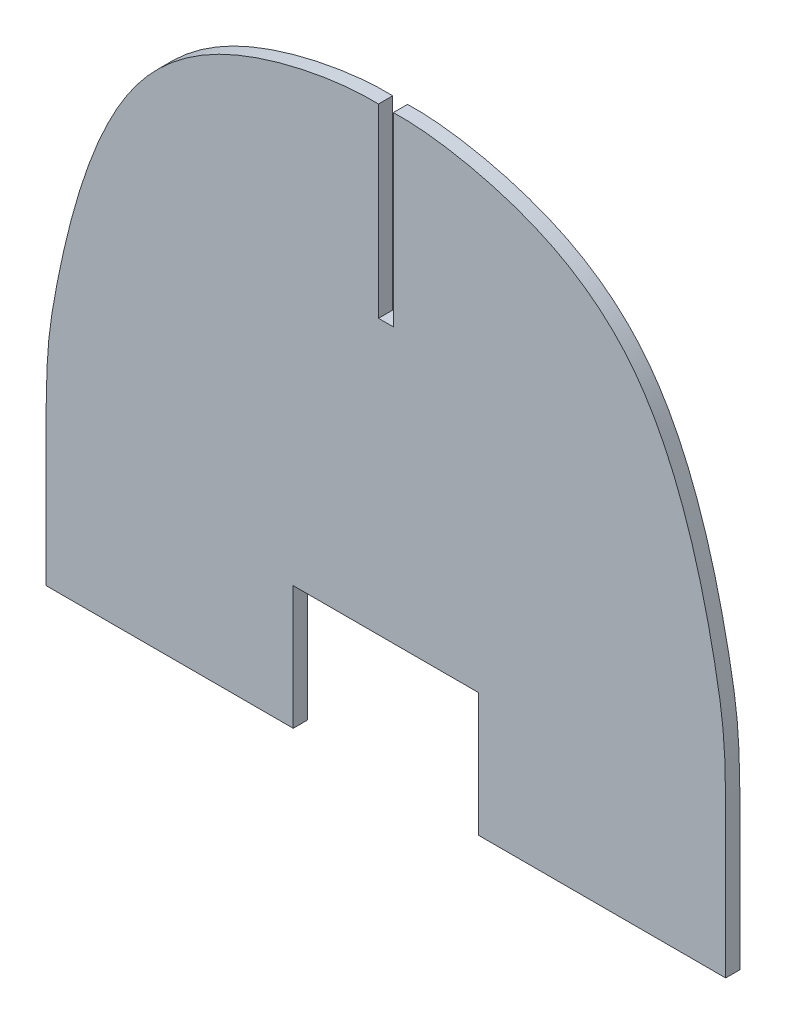
ISO-10303-21;
HEADER;
FILE_DESCRIPTION(('STEP AP214'),'2;1');
FILE_NAME('part.step','',(''),(''),'','','');
FILE_SCHEMA(('AUTOMOTIVE_DESIGN { 1 0 10303 214 1 1 1 1 }'));
ENDSEC;
DATA;
#1=APPLICATION_CONTEXT('core data for automotive mechanical design processes');
#2=APPLICATION_PROTOCOL_DEFINITION('international standard','automotive_design',2000,#1);
#3=PRODUCT_CONTEXT('',#1,'mechanical');
#4=PRODUCT('Part','Part','',(#3));
#5=PRODUCT_RELATED_PRODUCT_CATEGORY('part','',(#4));
#6=PRODUCT_DEFINITION_FORMATION('','',#4);
#7=PRODUCT_DEFINITION_CONTEXT('part definition',#1,'design');
#8=PRODUCT_DEFINITION('design','',#6,#7);
#9=PRODUCT_DEFINITION_SHAPE('','',#8);
#10=(LENGTH_UNIT() NAMED_UNIT(*) SI_UNIT(.MILLI.,.METRE.));
#11=(NAMED_UNIT(*) PLANE_ANGLE_UNIT() SI_UNIT($,.RADIAN.));
#12=(NAMED_UNIT(*) SI_UNIT($,.STERADIAN.) SOLID_ANGLE_UNIT());
#13=UNCERTAINTY_MEASURE_WITH_UNIT(LENGTH_MEASURE(1.E-05),#10,'distance_accuracy_value','');
#14=(GEOMETRIC_REPRESENTATION_CONTEXT(3) GLOBAL_UNCERTAINTY_ASSIGNED_CONTEXT((#13)) GLOBAL_UNIT_ASSIGNED_CONTEXT((#10,
#11,#12)) REPRESENTATION_CONTEXT('',''));
#15=CARTESIAN_POINT('',(0.,0.,0.));
#16=DIRECTION('',(0.,0.,1.));
#17=DIRECTION('',(1.,0.,0.));
#18=AXIS2_PLACEMENT_3D('',#15,#16,#17);
#19=CARTESIAN_POINT('',(139.7,39.6875,5.842));
#20=CARTESIAN_POINT('',(139.7,115.503243220382,5.842));
#21=CARTESIAN_POINT('',(141.431993663014,126.233406498269,5.842));
#22=CARTESIAN_POINT('',(117.029317673098,231.616459974822,5.842));
#23=CARTESIAN_POINT('',(63.3714943176251,272.227754170434,5.842));
#24=CARTESIAN_POINT('',(16.4923819257322,280.353025588496,5.842));
#25=CARTESIAN_POINT('',(0.899505201919916,279.4,5.842));
#26=CARTESIAN_POINT('',(0.,279.4,5.842));
#27=B_SPLINE_CURVE_WITH_KNOTS('',3,(#19,#20,#21,#22,#23,#24,#25,#26),.UNSPECIFIED.,.F.,.F.,(4,1,
1,1,1,4),(0.,0.342953298218703,0.632685127176625,0.805279320711567,0.990263966035578,1.),.UNSPECIFIED.);
#28=DIRECTION('',(0.,0.,-1.));
#29=VECTOR('',#28,1.);
#30=SURFACE_OF_LINEAR_EXTRUSION('',#27,#29);
#31=CARTESIAN_POINT('',(139.7,39.6875,0.));
#32=CARTESIAN_POINT('',(139.7,115.503243220382,0.));
#33=CARTESIAN_POINT('',(141.431993663014,126.233406498269,0.));
#34=CARTESIAN_POINT('',(117.029317673098,231.616459974822,0.));
#35=CARTESIAN_POINT('',(63.3714943176251,272.227754170434,0.));
#36=CARTESIAN_POINT('',(16.4923819257322,280.353025588496,0.));
#37=CARTESIAN_POINT('',(0.899505201919916,279.4,0.));
#38=CARTESIAN_POINT('',(0.,279.4,0.));
#39=B_SPLINE_CURVE_WITH_KNOTS('',3,(#31,#32,#33,#34,#35,#36,#37,#38),.UNSPECIFIED.,.F.,.F.,(4,1,
1,1,1,4),(0.,0.342953298218703,0.632685127176625,0.805279320711567,0.990263966035578,1.),.UNSPECIFIED.);
#40=CARTESIAN_POINT('',(139.7,39.6875,0.));
#41=VERTEX_POINT('',#40);
#42=CARTESIAN_POINT('',(3.048,279.504167611445,0.));
#43=VERTEX_POINT('',#42);
#44=EDGE_CURVE('E210',#41,#43,#39,.T.);
#45=ORIENTED_EDGE('',*,*,#44,.T.);
#46=DIRECTION('',(0.,0.,-1.));
#47=VECTOR('',#46,1.);
#48=CARTESIAN_POINT('',(3.04800000000001,279.504167611483,5.842));
#49=LINE('',#48,#47);
#50=CARTESIAN_POINT('',(3.048,279.504167611445,5.842));
#51=VERTEX_POINT('',#50);
#52=EDGE_CURVE('E223',#43,#51,#49,.F.);
#53=ORIENTED_EDGE('',*,*,#52,.T.);
#54=CARTESIAN_POINT('',(139.7,39.6875,5.842));
#55=VERTEX_POINT('',#54);
#56=EDGE_CURVE('E202',#55,#51,#27,.T.);
#57=ORIENTED_EDGE('',*,*,#56,.F.);
#58=DIRECTION('',(0.,0.,-1.));
#59=VECTOR('',#58,1.);
#60=CARTESIAN_POINT('',(139.7,39.6875,5.842));
#61=LINE('',#60,#59);
#62=EDGE_CURVE('E11',#55,#41,#61,.T.);
#63=ORIENTED_EDGE('',*,*,#62,.T.);
#64=EDGE_LOOP('',(#45,#53,#57,#63));
#65=FACE_BOUND('',#64,.T.);
#66=ADVANCED_FACE('F33',(#65),#30,.F.);
#67=CARTESIAN_POINT('',(139.7,39.6875,5.842));
#68=DIRECTION('',(0.,1.,0.));
#69=DIRECTION('',(-1.,0.,0.));
#70=AXIS2_PLACEMENT_3D('',#67,#68,#69);
#71=PLANE('',#70);
#72=DIRECTION('',(1.,0.,0.));
#73=VECTOR('',#72,1.);
#74=CARTESIAN_POINT('',(139.7,39.6875,5.842));
#75=LINE('',#74,#73);
#76=CARTESIAN_POINT('',(38.1,39.6875,5.842));
#77=VERTEX_POINT('',#76);
#78=EDGE_CURVE('E41',#77,#55,#75,.T.);
#79=ORIENTED_EDGE('',*,*,#78,.F.);
#80=DIRECTION('',(0.,0.,1.));
#81=VECTOR('',#80,1.);
#82=CARTESIAN_POINT('',(38.1,39.6875,0.));
#83=LINE('',#82,#81);
#84=CARTESIAN_POINT('',(38.1,39.6875,0.));
#85=VERTEX_POINT('',#84);
#86=EDGE_CURVE('E198',#85,#77,#83,.T.);
#87=ORIENTED_EDGE('',*,*,#86,.F.);
#88=DIRECTION('',(1.,0.,0.));
#89=VECTOR('',#88,1.);
#90=CARTESIAN_POINT('',(139.7,39.6875,0.));
#91=LINE('',#90,#89);
#92=EDGE_CURVE('E204',#85,#41,#91,.T.);
#93=ORIENTED_EDGE('',*,*,#92,.T.);
#94=ORIENTED_EDGE('',*,*,#62,.F.);
#95=EDGE_LOOP('',(#79,#87,#93,#94));
#96=FACE_BOUND('',#95,.T.);
#97=ADVANCED_FACE('F186',(#96),#71,.F.);
#98=CARTESIAN_POINT('',(123.600312479833,194.335664051359,5.842));
#99=DIRECTION('',(0.,0.,-1.));
#100=DIRECTION('',(-1.,0.,0.));
#101=AXIS2_PLACEMENT_3D('',#98,#99,#100);
#102=PLANE('',#101);
#103=ORIENTED_EDGE('',*,*,#56,.T.);
#104=DIRECTION('',(0.,1.,0.));
#105=VECTOR('',#104,1.);
#106=CARTESIAN_POINT('',(3.048,282.232492089932,5.842));
#107=LINE('',#106,#105);
#108=CARTESIAN_POINT('',(3.04800000000001,203.2,5.842));
#109=VERTEX_POINT('',#108);
#110=EDGE_CURVE('E118',#109,#51,#107,.T.);
#111=ORIENTED_EDGE('',*,*,#110,.F.);
#112=DIRECTION('',(1.,0.,0.));
#113=VECTOR('',#112,1.);
#114=CARTESIAN_POINT('',(0.,203.2,5.842));
#115=LINE('',#114,#113);
#116=CARTESIAN_POINT('',(-3.04800000000001,203.2,5.842));
#117=VERTEX_POINT('',#116);
#118=EDGE_CURVE('E110',#117,#109,#115,.T.);
#119=ORIENTED_EDGE('',*,*,#118,.F.);
#120=DIRECTION('',(0.,1.,0.));
#121=VECTOR('',#120,1.);
#122=CARTESIAN_POINT('',(-3.048,282.232492089932,5.842));
#123=LINE('',#122,#121);
#124=CARTESIAN_POINT('',(-3.048,279.504167611445,5.842));
#125=VERTEX_POINT('',#124);
#126=EDGE_CURVE('E116',#117,#125,#123,.T.);
#127=ORIENTED_EDGE('',*,*,#126,.T.);
#128=CARTESIAN_POINT('',(-139.7,39.6875,5.842));
#129=CARTESIAN_POINT('',(-139.7,115.503243220382,5.842));
#130=CARTESIAN_POINT('',(-141.431993663014,126.233406498269,5.842));
#131=CARTESIAN_POINT('',(-117.029317673098,231.616459974822,5.842));
#132=CARTESIAN_POINT('',(-63.3714943176251,272.227754170434,5.842));
#133=CARTESIAN_POINT('',(-16.4923819257322,280.353025588496,5.842));
#134=CARTESIAN_POINT('',(-0.899505201919916,279.4,5.842));
#135=CARTESIAN_POINT('',(0.,279.4,5.842));
#136=B_SPLINE_CURVE_WITH_KNOTS('',3,(#128,#129,#130,#131,#132,#133,#134,#135),.UNSPECIFIED.,.F.,
.F.,(4,1,1,1,1,4),(0.,0.342953298218703,0.632685127176625,0.805279320711567,0.990263966035578,
1.),.UNSPECIFIED.);
#137=CARTESIAN_POINT('',(-139.7,39.6875,5.842));
#138=VERTEX_POINT('',#137);
#139=EDGE_CURVE('E152',#138,#125,#136,.T.);
#140=ORIENTED_EDGE('',*,*,#139,.F.);
#141=DIRECTION('',(-1.,0.,0.));
#142=VECTOR('',#141,1.);
#143=CARTESIAN_POINT('',(-139.7,39.6875,5.842));
#144=LINE('',#143,#142);
#145=CARTESIAN_POINT('',(-38.1,39.6875,5.842));
#146=VERTEX_POINT('',#145);
#147=EDGE_CURVE('E157',#146,#138,#144,.T.);
#148=ORIENTED_EDGE('',*,*,#147,.F.);
#149=DIRECTION('',(0.,1.,0.));
#150=VECTOR('',#149,1.);
#151=CARTESIAN_POINT('',(-38.1,39.6875,5.842));
#152=LINE('',#151,#150);
#153=CARTESIAN_POINT('',(-38.1,90.4875,5.842));
#154=VERTEX_POINT('',#153);
#155=EDGE_CURVE('E139',#146,#154,#152,.T.);
#156=ORIENTED_EDGE('',*,*,#155,.T.);
#157=DIRECTION('',(-1.,0.,0.));
#158=VECTOR('',#157,1.);
#159=CARTESIAN_POINT('',(0.,90.4875,5.842));
#160=LINE('',#159,#158);
#161=CARTESIAN_POINT('',(38.1,90.4875,5.842));
#162=VERTEX_POINT('',#161);
#163=EDGE_CURVE('E233',#162,#154,#160,.T.);
#164=ORIENTED_EDGE('',*,*,#163,.F.);
#165=DIRECTION('',(0.,1.,0.));
#166=VECTOR('',#165,1.);
#167=CARTESIAN_POINT('',(38.1,39.6875,5.842));
#168=LINE('',#167,#166);
#169=EDGE_CURVE('E230',#77,#162,#168,.T.);
#170=ORIENTED_EDGE('',*,*,#169,.F.);
#171=ORIENTED_EDGE('',*,*,#78,.T.);
#172=EDGE_LOOP('',(#103,#111,#119,#127,#140,#148,#156,#164,#170,#171));
#173=FACE_BOUND('',#172,.T.);
#174=ADVANCED_FACE('F113',(#173),#102,.F.);
#175=CARTESIAN_POINT('',(123.600312479833,194.335664051359,0.));
#176=DIRECTION('',(0.,0.,-1.));
#177=DIRECTION('',(-1.,0.,0.));
#178=AXIS2_PLACEMENT_3D('',#175,#176,#177);
#179=PLANE('',#178);
#180=DIRECTION('',(0.,1.,0.));
#181=VECTOR('',#180,1.);
#182=CARTESIAN_POINT('',(3.048,282.232492089932,0.));
#183=LINE('',#182,#181);
#184=CARTESIAN_POINT('',(3.04800000000001,203.2,0.));
#185=VERTEX_POINT('',#184);
#186=EDGE_CURVE('E48',#185,#43,#183,.T.);
#187=ORIENTED_EDGE('',*,*,#186,.T.);
#188=ORIENTED_EDGE('',*,*,#44,.F.);
#189=ORIENTED_EDGE('',*,*,#92,.F.);
#190=DIRECTION('',(0.,1.,0.));
#191=VECTOR('',#190,1.);
#192=CARTESIAN_POINT('',(38.1,39.6875,0.));
#193=LINE('',#192,#191);
#194=CARTESIAN_POINT('',(38.1,90.4875,0.));
#195=VERTEX_POINT('',#194);
#196=EDGE_CURVE('E231',#85,#195,#193,.T.);
#197=ORIENTED_EDGE('',*,*,#196,.T.);
#198=DIRECTION('',(-1.,0.,0.));
#199=VECTOR('',#198,1.);
#200=CARTESIAN_POINT('',(0.,90.4875,0.));
#201=LINE('',#200,#199);
#202=CARTESIAN_POINT('',(-38.1,90.4875,0.));
#203=VERTEX_POINT('',#202);
#204=EDGE_CURVE('E56',#195,#203,#201,.T.);
#205=ORIENTED_EDGE('',*,*,#204,.T.);
#206=DIRECTION('',(0.,1.,0.));
#207=VECTOR('',#206,1.);
#208=CARTESIAN_POINT('',(-38.1,39.6875,0.));
#209=LINE('',#208,#207);
#210=CARTESIAN_POINT('',(-38.1,39.6875,0.));
#211=VERTEX_POINT('',#210);
#212=EDGE_CURVE('E140',#211,#203,#209,.T.);
#213=ORIENTED_EDGE('',*,*,#212,.F.);
#214=DIRECTION('',(-1.,0.,0.));
#215=VECTOR('',#214,1.);
#216=CARTESIAN_POINT('',(-139.7,39.6875,0.));
#217=LINE('',#216,#215);
#218=CARTESIAN_POINT('',(-139.7,39.6875,0.));
#219=VERTEX_POINT('',#218);
#220=EDGE_CURVE('E158',#211,#219,#217,.T.);
#221=ORIENTED_EDGE('',*,*,#220,.T.);
#222=CARTESIAN_POINT('',(-139.7,39.6875,0.));
#223=CARTESIAN_POINT('',(-139.7,115.503243220382,0.));
#224=CARTESIAN_POINT('',(-141.431993663014,126.233406498269,0.));
#225=CARTESIAN_POINT('',(-117.029317673098,231.616459974822,0.));
#226=CARTESIAN_POINT('',(-63.3714943176251,272.227754170434,0.));
#227=CARTESIAN_POINT('',(-16.4923819257322,280.353025588496,0.));
#228=CARTESIAN_POINT('',(-0.899505201919916,279.4,0.));
#229=CARTESIAN_POINT('',(0.,279.4,0.));
#230=B_SPLINE_CURVE_WITH_KNOTS('',3,(#222,#223,#224,#225,#226,#227,#228,#229),.UNSPECIFIED.,.F.,
.F.,(4,1,1,1,1,4),(0.,0.342953298218703,0.632685127176625,0.805279320711567,0.990263966035578,
1.),.UNSPECIFIED.);
#231=CARTESIAN_POINT('',(-3.048,279.504167611445,0.));
#232=VERTEX_POINT('',#231);
#233=EDGE_CURVE('E149',#219,#232,#230,.T.);
#234=ORIENTED_EDGE('',*,*,#233,.T.);
#235=DIRECTION('',(0.,1.,0.));
#236=VECTOR('',#235,1.);
#237=CARTESIAN_POINT('',(-3.048,282.232492089932,0.));
#238=LINE('',#237,#236);
#239=CARTESIAN_POINT('',(-3.04800000000001,203.2,0.));
#240=VERTEX_POINT('',#239);
#241=EDGE_CURVE('E130',#240,#232,#238,.T.);
#242=ORIENTED_EDGE('',*,*,#241,.F.);
#243=DIRECTION('',(1.,0.,0.));
#244=VECTOR('',#243,1.);
#245=CARTESIAN_POINT('',(0.,203.2,0.));
#246=LINE('',#245,#244);
#247=EDGE_CURVE('E126',#240,#185,#246,.T.);
#248=ORIENTED_EDGE('',*,*,#247,.T.);
#249=EDGE_LOOP('',(#187,#188,#189,#197,#205,#213,#221,#234,#242,#248));
#250=FACE_BOUND('',#249,.T.);
#251=ADVANCED_FACE('F180',(#250),#179,.T.);
#252=CARTESIAN_POINT('',(0.,90.4875,0.));
#253=DIRECTION('',(0.,1.,0.));
#254=DIRECTION('',(0.,0.,1.));
#255=AXIS2_PLACEMENT_3D('',#252,#253,#254);
#256=PLANE('',#255);
#257=ORIENTED_EDGE('',*,*,#163,.T.);
#258=DIRECTION('',(0.,0.,1.));
#259=VECTOR('',#258,1.);
#260=CARTESIAN_POINT('',(-38.1,90.4875,0.));
#261=LINE('',#260,#259);
#262=EDGE_CURVE('E146',#203,#154,#261,.T.);
#263=ORIENTED_EDGE('',*,*,#262,.F.);
#264=ORIENTED_EDGE('',*,*,#204,.F.);
#265=DIRECTION('',(0.,0.,1.));
#266=VECTOR('',#265,1.);
#267=CARTESIAN_POINT('',(38.1,90.4875,0.));
#268=LINE('',#267,#266);
#269=EDGE_CURVE('E214',#195,#162,#268,.T.);
#270=ORIENTED_EDGE('',*,*,#269,.T.);
#271=EDGE_LOOP('',(#257,#263,#264,#270));
#272=FACE_BOUND('',#271,.T.);
#273=ADVANCED_FACE('F177',(#272),#256,.F.);
#274=CARTESIAN_POINT('',(38.1,39.6875,0.));
#275=DIRECTION('',(1.,0.,0.));
#276=DIRECTION('',(0.,0.,-1.));
#277=AXIS2_PLACEMENT_3D('',#274,#275,#276);
#278=PLANE('',#277);
#279=ORIENTED_EDGE('',*,*,#169,.T.);
#280=ORIENTED_EDGE('',*,*,#269,.F.);
#281=ORIENTED_EDGE('',*,*,#196,.F.);
#282=ORIENTED_EDGE('',*,*,#86,.T.);
#283=EDGE_LOOP('',(#279,#280,#281,#282));
#284=FACE_BOUND('',#283,.T.);
#285=ADVANCED_FACE('F174',(#284),#278,.F.);
#286=CARTESIAN_POINT('',(3.048,282.232492089932,0.));
#287=DIRECTION('',(1.,0.,0.));
#288=DIRECTION('',(0.,1.,0.));
#289=AXIS2_PLACEMENT_3D('',#286,#287,#288);
#290=PLANE('',#289);
#291=ORIENTED_EDGE('',*,*,#186,.F.);
#292=DIRECTION('',(0.,0.,1.));
#293=VECTOR('',#292,1.);
#294=CARTESIAN_POINT('',(3.04800000000001,203.2,0.));
#295=LINE('',#294,#293);
#296=EDGE_CURVE('E221',#185,#109,#295,.T.);
#297=ORIENTED_EDGE('',*,*,#296,.T.);
#298=ORIENTED_EDGE('',*,*,#110,.T.);
#299=ORIENTED_EDGE('',*,*,#52,.F.);
#300=EDGE_LOOP('',(#291,#297,#298,#299));
#301=FACE_BOUND('',#300,.T.);
#302=ADVANCED_FACE('F171',(#301),#290,.F.);
#303=CARTESIAN_POINT('',(0.,203.2,0.));
#304=DIRECTION('',(0.,-1.,0.));
#305=DIRECTION('',(0.,0.,-1.));
#306=AXIS2_PLACEMENT_3D('',#303,#304,#305);
#307=PLANE('',#306);
#308=ORIENTED_EDGE('',*,*,#118,.T.);
#309=ORIENTED_EDGE('',*,*,#296,.F.);
#310=ORIENTED_EDGE('',*,*,#247,.F.);
#311=DIRECTION('',(0.,0.,1.));
#312=VECTOR('',#311,1.);
#313=CARTESIAN_POINT('',(-3.04800000000001,203.2,0.));
#314=LINE('',#313,#312);
#315=EDGE_CURVE('E123',#240,#117,#314,.T.);
#316=ORIENTED_EDGE('',*,*,#315,.T.);
#317=EDGE_LOOP('',(#308,#309,#310,#316));
#318=FACE_BOUND('',#317,.T.);
#319=ADVANCED_FACE('F124',(#318),#307,.F.);
#320=DIRECTION('',(0.,0.,-1.));
#321=VECTOR('',#320,1.);
#322=SURFACE_OF_LINEAR_EXTRUSION('',#136,#321);
#323=ORIENTED_EDGE('',*,*,#233,.F.);
#324=DIRECTION('',(0.,0.,-1.));
#325=VECTOR('',#324,1.);
#326=CARTESIAN_POINT('',(-139.7,39.6875,5.842));
#327=LINE('',#326,#325);
#328=EDGE_CURVE('E120',#138,#219,#327,.T.);
#329=ORIENTED_EDGE('',*,*,#328,.F.);
#330=ORIENTED_EDGE('',*,*,#139,.T.);
#331=DIRECTION('',(0.,0.,-1.));
#332=VECTOR('',#331,1.);
#333=CARTESIAN_POINT('',(-3.04800000000001,279.504167611483,5.842));
#334=LINE('',#333,#332);
#335=EDGE_CURVE('E129',#232,#125,#334,.F.);
#336=ORIENTED_EDGE('',*,*,#335,.F.);
#337=EDGE_LOOP('',(#323,#329,#330,#336));
#338=FACE_BOUND('',#337,.T.);
#339=ADVANCED_FACE('F164',(#338),#322,.T.);
#340=CARTESIAN_POINT('',(-139.7,39.6875,5.842));
#341=DIRECTION('',(0.,1.,0.));
#342=DIRECTION('',(1.,0.,0.));
#343=AXIS2_PLACEMENT_3D('',#340,#341,#342);
#344=PLANE('',#343);
#345=ORIENTED_EDGE('',*,*,#147,.T.);
#346=ORIENTED_EDGE('',*,*,#328,.T.);
#347=ORIENTED_EDGE('',*,*,#220,.F.);
#348=DIRECTION('',(0.,0.,1.));
#349=VECTOR('',#348,1.);
#350=CARTESIAN_POINT('',(-38.1,39.6875,0.));
#351=LINE('',#350,#349);
#352=EDGE_CURVE('E143',#211,#146,#351,.T.);
#353=ORIENTED_EDGE('',*,*,#352,.T.);
#354=EDGE_LOOP('',(#345,#346,#347,#353));
#355=FACE_BOUND('',#354,.T.);
#356=ADVANCED_FACE('F168',(#355),#344,.F.);
#357=CARTESIAN_POINT('',(-38.1,39.6875,0.));
#358=DIRECTION('',(-1.,0.,0.));
#359=DIRECTION('',(0.,0.,-1.));
#360=AXIS2_PLACEMENT_3D('',#357,#358,#359);
#361=PLANE('',#360);
#362=ORIENTED_EDGE('',*,*,#155,.F.);
#363=ORIENTED_EDGE('',*,*,#352,.F.);
#364=ORIENTED_EDGE('',*,*,#212,.T.);
#365=ORIENTED_EDGE('',*,*,#262,.T.);
#366=EDGE_LOOP('',(#362,#363,#364,#365));
#367=FACE_BOUND('',#366,.T.);
#368=ADVANCED_FACE('F241',(#367),#361,.F.);
#369=CARTESIAN_POINT('',(-3.048,282.232492089932,0.));
#370=DIRECTION('',(-1.,0.,0.));
#371=DIRECTION('',(0.,1.,0.));
#372=AXIS2_PLACEMENT_3D('',#369,#370,#371);
#373=PLANE('',#372);
#374=ORIENTED_EDGE('',*,*,#241,.T.);
#375=ORIENTED_EDGE('',*,*,#335,.T.);
#376=ORIENTED_EDGE('',*,*,#126,.F.);
#377=ORIENTED_EDGE('',*,*,#315,.F.);
#378=EDGE_LOOP('',(#374,#375,#376,#377));
#379=FACE_BOUND('',#378,.T.);
#380=ADVANCED_FACE('F132',(#379),#373,.F.);
#381=CLOSED_SHELL('',(#66,#97,#174,#251,#273,#285,#302,#319,#339,#356,#368,#380));
#382=MANIFOLD_SOLID_BREP('B2',#381);
#383=ADVANCED_BREP_SHAPE_REPRESENTATION('',(#18,#382),#14);
#384=SHAPE_DEFINITION_REPRESENTATION(#9,#383);
ENDSEC;
END-ISO-10303-21;
